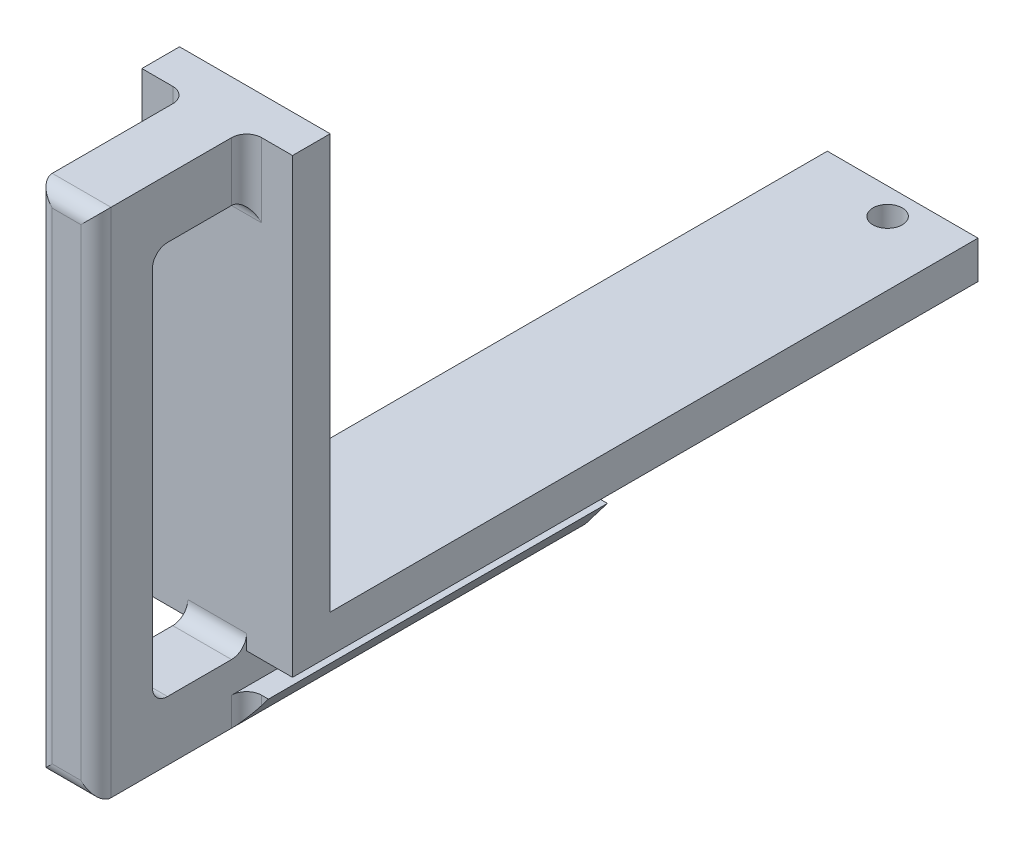
ISO-10303-21;
HEADER;
FILE_DESCRIPTION(('STEP AP214'),'2;1');
FILE_NAME('part.step','',(''),(''),'','','');
FILE_SCHEMA(('AUTOMOTIVE_DESIGN { 1 0 10303 214 1 1 1 1 }'));
ENDSEC;
DATA;
#1=APPLICATION_CONTEXT('core data for automotive mechanical design processes');
#2=APPLICATION_PROTOCOL_DEFINITION('international standard','automotive_design',2000,#1);
#3=PRODUCT_CONTEXT('',#1,'mechanical');
#4=PRODUCT('Part','Part','',(#3));
#5=PRODUCT_RELATED_PRODUCT_CATEGORY('part','',(#4));
#6=PRODUCT_DEFINITION_FORMATION('','',#4);
#7=PRODUCT_DEFINITION_CONTEXT('part definition',#1,'design');
#8=PRODUCT_DEFINITION('design','',#6,#7);
#9=PRODUCT_DEFINITION_SHAPE('','',#8);
#10=(LENGTH_UNIT() NAMED_UNIT(*) SI_UNIT(.MILLI.,.METRE.));
#11=(NAMED_UNIT(*) PLANE_ANGLE_UNIT() SI_UNIT($,.RADIAN.));
#12=(NAMED_UNIT(*) SI_UNIT($,.STERADIAN.) SOLID_ANGLE_UNIT());
#13=UNCERTAINTY_MEASURE_WITH_UNIT(LENGTH_MEASURE(1.E-05),#10,'distance_accuracy_value','');
#14=(GEOMETRIC_REPRESENTATION_CONTEXT(3) GLOBAL_UNCERTAINTY_ASSIGNED_CONTEXT((#13)) GLOBAL_UNIT_ASSIGNED_CONTEXT((#10,
#11,#12)) REPRESENTATION_CONTEXT('',''));
#15=CARTESIAN_POINT('',(0.,0.,0.));
#16=DIRECTION('',(0.,0.,1.));
#17=DIRECTION('',(1.,0.,0.));
#18=AXIS2_PLACEMENT_3D('',#15,#16,#17);
#19=CARTESIAN_POINT('',(0.,0.,48.));
#20=DIRECTION('',(0.,0.,1.));
#21=DIRECTION('',(1.,0.,0.));
#22=AXIS2_PLACEMENT_3D('',#19,#20,#21);
#23=PLANE('',#22);
#24=DIRECTION('',(1.,0.,0.));
#25=VECTOR('',#24,1.);
#26=CARTESIAN_POINT('',(-10.,0.,48.));
#27=LINE('',#26,#25);
#28=CARTESIAN_POINT('',(-10.,0.,48.));
#29=VERTEX_POINT('',#28);
#30=CARTESIAN_POINT('',(-3.90000000000001,0.,48.));
#31=VERTEX_POINT('',#30);
#32=EDGE_CURVE('E266',#29,#31,#27,.T.);
#33=ORIENTED_EDGE('',*,*,#32,.T.);
#34=DIRECTION('',(0.,1.,0.));
#35=VECTOR('',#34,1.);
#36=CARTESIAN_POINT('',(-3.90000000000001,0.,48.));
#37=LINE('',#36,#35);
#38=CARTESIAN_POINT('',(-3.90000000000001,2.,48.));
#39=VERTEX_POINT('',#38);
#40=EDGE_CURVE('E62',#31,#39,#37,.T.);
#41=ORIENTED_EDGE('',*,*,#40,.T.);
#42=DIRECTION('',(-1.,0.,0.));
#43=VECTOR('',#42,1.);
#44=CARTESIAN_POINT('',(0.,2.,48.));
#45=LINE('',#44,#43);
#46=CARTESIAN_POINT('',(3.89999999999998,2.,48.));
#47=VERTEX_POINT('',#46);
#48=EDGE_CURVE('E253',#39,#47,#45,.F.);
#49=ORIENTED_EDGE('',*,*,#48,.T.);
#50=DIRECTION('',(0.,-1.,0.));
#51=VECTOR('',#50,1.);
#52=CARTESIAN_POINT('',(3.89999999999999,-4.1,48.));
#53=LINE('',#52,#51);
#54=CARTESIAN_POINT('',(3.89999999999998,0.,48.));
#55=VERTEX_POINT('',#54);
#56=EDGE_CURVE('E248',#47,#55,#53,.T.);
#57=ORIENTED_EDGE('',*,*,#56,.T.);
#58=CARTESIAN_POINT('',(10.,0.,48.));
#59=VERTEX_POINT('',#58);
#60=EDGE_CURVE('E292',#55,#59,#27,.T.);
#61=ORIENTED_EDGE('',*,*,#60,.T.);
#62=DIRECTION('',(0.,-1.,0.));
#63=VECTOR('',#62,1.);
#64=CARTESIAN_POINT('',(10.,60.,48.));
#65=LINE('',#64,#63);
#66=CARTESIAN_POINT('',(10.,60.,48.));
#67=VERTEX_POINT('',#66);
#68=EDGE_CURVE('E328',#67,#59,#65,.T.);
#69=ORIENTED_EDGE('',*,*,#68,.F.);
#70=DIRECTION('',(1.,0.,0.));
#71=VECTOR('',#70,1.);
#72=CARTESIAN_POINT('',(-10.,60.,48.));
#73=LINE('',#72,#71);
#74=CARTESIAN_POINT('',(5.89999999999995,60.,48.));
#75=VERTEX_POINT('',#74);
#76=EDGE_CURVE('E307',#75,#67,#73,.T.);
#77=ORIENTED_EDGE('',*,*,#76,.F.);
#78=DIRECTION('',(0.,1.,0.));
#79=VECTOR('',#78,1.);
#80=CARTESIAN_POINT('',(5.89999999999995,52.2,48.));
#81=LINE('',#80,#79);
#82=CARTESIAN_POINT('',(5.89999999999995,50.2,48.));
#83=VERTEX_POINT('',#82);
#84=EDGE_CURVE('E255',#75,#83,#81,.F.);
#85=ORIENTED_EDGE('',*,*,#84,.T.);
#86=DIRECTION('',(1.,0.,0.));
#87=VECTOR('',#86,1.);
#88=CARTESIAN_POINT('',(0.,50.2,48.));
#89=LINE('',#88,#87);
#90=CARTESIAN_POINT('',(-5.89999999999999,50.2,48.));
#91=VERTEX_POINT('',#90);
#92=EDGE_CURVE('E231',#83,#91,#89,.F.);
#93=ORIENTED_EDGE('',*,*,#92,.T.);
#94=DIRECTION('',(0.,-1.,0.));
#95=VECTOR('',#94,1.);
#96=CARTESIAN_POINT('',(-5.89999999999999,60.,48.));
#97=LINE('',#96,#95);
#98=CARTESIAN_POINT('',(-5.89999999999999,60.,48.));
#99=VERTEX_POINT('',#98);
#100=EDGE_CURVE('E242',#91,#99,#97,.F.);
#101=ORIENTED_EDGE('',*,*,#100,.T.);
#102=CARTESIAN_POINT('',(-10.,60.,48.));
#103=VERTEX_POINT('',#102);
#104=EDGE_CURVE('E308',#103,#99,#73,.T.);
#105=ORIENTED_EDGE('',*,*,#104,.F.);
#106=DIRECTION('',(0.,-1.,0.));
#107=VECTOR('',#106,1.);
#108=CARTESIAN_POINT('',(-10.,60.,48.));
#109=LINE('',#108,#107);
#110=EDGE_CURVE('E332',#103,#29,#109,.T.);
#111=ORIENTED_EDGE('',*,*,#110,.T.);
#112=EDGE_LOOP('',(#33,#41,#49,#57,#61,#69,#77,#85,#93,#101,#105,#111));
#113=FACE_BOUND('',#112,.T.);
#114=ADVANCED_FACE('F43',(#113),#23,.T.);
#115=DIRECTION('',(-1.,0.,0.));
#116=VECTOR('',#115,1.);
#117=CARTESIAN_POINT('',(6.79999999999999,-4.1,48.));
#118=LINE('',#117,#116);
#119=CARTESIAN_POINT('',(6.79999999999999,-4.1,48.));
#120=VERTEX_POINT('',#119);
#121=CARTESIAN_POINT('',(5.89999999999999,-4.1,48.));
#122=VERTEX_POINT('',#121);
#123=EDGE_CURVE('E143',#120,#122,#118,.T.);
#124=ORIENTED_EDGE('',*,*,#123,.T.);
#125=DIRECTION('',(0.,1.,0.));
#126=VECTOR('',#125,1.);
#127=CARTESIAN_POINT('',(5.89999999999999,-7.9,48.));
#128=LINE('',#127,#126);
#129=CARTESIAN_POINT('',(5.89999999999999,-5.27931034482758,48.));
#130=VERTEX_POINT('',#129);
#131=EDGE_CURVE('E133',#122,#130,#128,.F.);
#132=ORIENTED_EDGE('',*,*,#131,.T.);
#133=DIRECTION('',(0.606673319350191,0.794951246045077,0.));
#134=VECTOR('',#133,1.);
#135=CARTESIAN_POINT('',(3.89999999999999,-7.9,48.));
#136=LINE('',#135,#134);
#137=EDGE_CURVE('E155',#130,#120,#136,.T.);
#138=ORIENTED_EDGE('',*,*,#137,.T.);
#139=EDGE_LOOP('',(#124,#132,#138));
#140=FACE_BOUND('',#139,.T.);
#141=ADVANCED_FACE('F154',(#140),#23,.T.);
#142=DIRECTION('',(0.606673319350191,-0.794951246045077,0.));
#143=VECTOR('',#142,1.);
#144=CARTESIAN_POINT('',(-6.80000000000001,-4.1,48.));
#145=LINE('',#144,#143);
#146=CARTESIAN_POINT('',(-6.80000000000001,-4.1,48.));
#147=VERTEX_POINT('',#146);
#148=CARTESIAN_POINT('',(-5.90000000000002,-5.27931034482759,48.));
#149=VERTEX_POINT('',#148);
#150=EDGE_CURVE('E339',#147,#149,#145,.T.);
#151=ORIENTED_EDGE('',*,*,#150,.T.);
#152=DIRECTION('',(0.,-1.,0.));
#153=VECTOR('',#152,1.);
#154=CARTESIAN_POINT('',(-5.90000000000001,-4.1,48.));
#155=LINE('',#154,#153);
#156=CARTESIAN_POINT('',(-5.90000000000001,-4.1,48.));
#157=VERTEX_POINT('',#156);
#158=EDGE_CURVE('E165',#149,#157,#155,.F.);
#159=ORIENTED_EDGE('',*,*,#158,.T.);
#160=DIRECTION('',(-1.,0.,0.));
#161=VECTOR('',#160,1.);
#162=CARTESIAN_POINT('',(-3.90000000000001,-4.1,48.));
#163=LINE('',#162,#161);
#164=EDGE_CURVE('E335',#157,#147,#163,.T.);
#165=ORIENTED_EDGE('',*,*,#164,.T.);
#166=EDGE_LOOP('',(#151,#159,#165));
#167=FACE_BOUND('',#166,.T.);
#168=ADVANCED_FACE('F699',(#167),#23,.T.);
#169=CARTESIAN_POINT('',(10.,5.,43.));
#170=DIRECTION('',(-1.,0.,0.));
#171=DIRECTION('',(0.,0.,1.));
#172=AXIS2_PLACEMENT_3D('',#169,#170,#171);
#173=PLANE('',#172);
#174=DIRECTION('',(0.,0.,-1.));
#175=VECTOR('',#174,1.);
#176=CARTESIAN_POINT('',(10.,0.,43.));
#177=LINE('',#176,#175);
#178=CARTESIAN_POINT('',(10.,0.,-43.));
#179=VERTEX_POINT('',#178);
#180=EDGE_CURVE('E391',#59,#179,#177,.T.);
#181=ORIENTED_EDGE('',*,*,#180,.T.);
#182=DIRECTION('',(0.,-1.,0.));
#183=VECTOR('',#182,1.);
#184=CARTESIAN_POINT('',(10.,5.,-43.));
#185=LINE('',#184,#183);
#186=CARTESIAN_POINT('',(10.,5.,-43.));
#187=VERTEX_POINT('',#186);
#188=EDGE_CURVE('E442',#187,#179,#185,.T.);
#189=ORIENTED_EDGE('',*,*,#188,.F.);
#190=DIRECTION('',(0.,0.,-1.));
#191=VECTOR('',#190,1.);
#192=CARTESIAN_POINT('',(10.,5.,43.));
#193=LINE('',#192,#191);
#194=CARTESIAN_POINT('',(10.,5.,43.));
#195=VERTEX_POINT('',#194);
#196=EDGE_CURVE('E411',#195,#187,#193,.T.);
#197=ORIENTED_EDGE('',*,*,#196,.F.);
#198=DIRECTION('',(0.,-1.,0.));
#199=VECTOR('',#198,1.);
#200=CARTESIAN_POINT('',(10.,60.,43.));
#201=LINE('',#200,#199);
#202=CARTESIAN_POINT('',(10.,60.,43.));
#203=VERTEX_POINT('',#202);
#204=EDGE_CURVE('E324',#203,#195,#201,.T.);
#205=ORIENTED_EDGE('',*,*,#204,.F.);
#206=DIRECTION('',(0.,0.,-1.));
#207=VECTOR('',#206,1.);
#208=CARTESIAN_POINT('',(10.,60.,43.));
#209=LINE('',#208,#207);
#210=EDGE_CURVE('E311',#67,#203,#209,.T.);
#211=ORIENTED_EDGE('',*,*,#210,.F.);
#212=ORIENTED_EDGE('',*,*,#68,.T.);
#213=EDGE_LOOP('',(#181,#189,#197,#205,#211,#212));
#214=FACE_BOUND('',#213,.T.);
#215=ADVANCED_FACE('F706',(#214),#173,.F.);
#216=CARTESIAN_POINT('',(-10.,5.,-43.));
#217=DIRECTION('',(0.,0.,1.));
#218=DIRECTION('',(1.,0.,0.));
#219=AXIS2_PLACEMENT_3D('',#216,#217,#218);
#220=PLANE('',#219);
#221=DIRECTION('',(-1.,0.,0.));
#222=VECTOR('',#221,1.);
#223=CARTESIAN_POINT('',(-10.,0.,-43.));
#224=LINE('',#223,#222);
#225=CARTESIAN_POINT('',(-10.,0.,-43.));
#226=VERTEX_POINT('',#225);
#227=EDGE_CURVE('E432',#179,#226,#224,.T.);
#228=ORIENTED_EDGE('',*,*,#227,.T.);
#229=DIRECTION('',(0.,-1.,0.));
#230=VECTOR('',#229,1.);
#231=CARTESIAN_POINT('',(-10.,5.,-43.));
#232=LINE('',#231,#230);
#233=CARTESIAN_POINT('',(-10.,5.,-43.));
#234=VERTEX_POINT('',#233);
#235=EDGE_CURVE('E428',#234,#226,#232,.T.);
#236=ORIENTED_EDGE('',*,*,#235,.F.);
#237=DIRECTION('',(-1.,0.,0.));
#238=VECTOR('',#237,1.);
#239=CARTESIAN_POINT('',(-10.,5.,-43.));
#240=LINE('',#239,#238);
#241=EDGE_CURVE('E415',#187,#234,#240,.T.);
#242=ORIENTED_EDGE('',*,*,#241,.F.);
#243=ORIENTED_EDGE('',*,*,#188,.T.);
#244=EDGE_LOOP('',(#228,#236,#242,#243));
#245=FACE_BOUND('',#244,.T.);
#246=ADVANCED_FACE('F711',(#245),#220,.F.);
#247=CARTESIAN_POINT('',(-10.,5.,43.));
#248=DIRECTION('',(1.,0.,0.));
#249=DIRECTION('',(0.,0.,-1.));
#250=AXIS2_PLACEMENT_3D('',#247,#248,#249);
#251=PLANE('',#250);
#252=DIRECTION('',(0.,0.,1.));
#253=VECTOR('',#252,1.);
#254=CARTESIAN_POINT('',(-10.,0.,43.));
#255=LINE('',#254,#253);
#256=EDGE_CURVE('E416',#226,#29,#255,.T.);
#257=ORIENTED_EDGE('',*,*,#256,.T.);
#258=ORIENTED_EDGE('',*,*,#110,.F.);
#259=DIRECTION('',(0.,0.,1.));
#260=VECTOR('',#259,1.);
#261=CARTESIAN_POINT('',(-10.,60.,43.));
#262=LINE('',#261,#260);
#263=CARTESIAN_POINT('',(-10.,60.,43.));
#264=VERTEX_POINT('',#263);
#265=EDGE_CURVE('E303',#264,#103,#262,.T.);
#266=ORIENTED_EDGE('',*,*,#265,.F.);
#267=DIRECTION('',(0.,-1.,0.));
#268=VECTOR('',#267,1.);
#269=CARTESIAN_POINT('',(-10.,60.,43.));
#270=LINE('',#269,#268);
#271=CARTESIAN_POINT('',(-10.,5.,43.));
#272=VERTEX_POINT('',#271);
#273=EDGE_CURVE('E318',#264,#272,#270,.T.);
#274=ORIENTED_EDGE('',*,*,#273,.T.);
#275=DIRECTION('',(0.,0.,1.));
#276=VECTOR('',#275,1.);
#277=CARTESIAN_POINT('',(-10.,5.,43.));
#278=LINE('',#277,#276);
#279=EDGE_CURVE('E420',#234,#272,#278,.T.);
#280=ORIENTED_EDGE('',*,*,#279,.F.);
#281=ORIENTED_EDGE('',*,*,#235,.T.);
#282=EDGE_LOOP('',(#257,#258,#266,#274,#280,#281));
#283=FACE_BOUND('',#282,.T.);
#284=ADVANCED_FACE('F632',(#283),#251,.F.);
#285=CARTESIAN_POINT('',(0.,5.,0.));
#286=DIRECTION('',(0.,-1.,0.));
#287=DIRECTION('',(0.,0.,-1.));
#288=AXIS2_PLACEMENT_3D('',#285,#286,#287);
#289=PLANE('',#288);
#290=CARTESIAN_POINT('',(1.49999999999999,5.,39.5));
#291=DIRECTION('',(0.,1.,0.));
#292=DIRECTION('',(0.,0.,1.));
#293=AXIS2_PLACEMENT_3D('',#290,#291,#292);
#294=CIRCLE('',#293,1.95);
#295=CARTESIAN_POINT('',(1.49999999999999,5.,41.45));
#296=VERTEX_POINT('',#295);
#297=EDGE_CURVE('E350',#296,#296,#294,.T.);
#298=ORIENTED_EDGE('',*,*,#297,.F.);
#299=EDGE_LOOP('',(#298));
#300=FACE_BOUND('',#299,.T.);
#301=CARTESIAN_POINT('',(1.49999999999998,5.,-39.5));
#302=DIRECTION('',(0.,1.,0.));
#303=DIRECTION('',(0.,0.,1.));
#304=AXIS2_PLACEMENT_3D('',#301,#302,#303);
#305=CIRCLE('',#304,1.95);
#306=CARTESIAN_POINT('',(1.49999999999998,5.,-37.55));
#307=VERTEX_POINT('',#306);
#308=EDGE_CURVE('E158',#307,#307,#305,.T.);
#309=ORIENTED_EDGE('',*,*,#308,.F.);
#310=EDGE_LOOP('',(#309));
#311=FACE_BOUND('',#310,.T.);
#312=ORIENTED_EDGE('',*,*,#196,.T.);
#313=ORIENTED_EDGE('',*,*,#241,.T.);
#314=ORIENTED_EDGE('',*,*,#279,.T.);
#315=DIRECTION('',(1.,0.,0.));
#316=VECTOR('',#315,1.);
#317=CARTESIAN_POINT('',(-10.,5.,43.));
#318=LINE('',#317,#316);
#319=EDGE_CURVE('E424',#272,#195,#318,.T.);
#320=ORIENTED_EDGE('',*,*,#319,.T.);
#321=EDGE_LOOP('',(#312,#313,#314,#320));
#322=FACE_BOUND('',#321,.T.);
#323=ADVANCED_FACE('F730',(#300,#311,#322),#289,.F.);
#324=CARTESIAN_POINT('',(0.,0.,0.));
#325=DIRECTION('',(0.,-1.,0.));
#326=DIRECTION('',(0.,0.,-1.));
#327=AXIS2_PLACEMENT_3D('',#324,#325,#326);
#328=PLANE('',#327);
#329=CARTESIAN_POINT('',(1.49999999999998,0.,-39.5));
#330=DIRECTION('',(0.,-1.,0.));
#331=DIRECTION('',(0.,0.,-1.));
#332=AXIS2_PLACEMENT_3D('',#329,#330,#331);
#333=CIRCLE('',#332,1.95);
#334=CARTESIAN_POINT('',(1.49999999999998,0.,-41.45));
#335=VERTEX_POINT('',#334);
#336=EDGE_CURVE('E349',#335,#335,#333,.T.);
#337=ORIENTED_EDGE('',*,*,#336,.F.);
#338=EDGE_LOOP('',(#337));
#339=FACE_BOUND('',#338,.T.);
#340=DIRECTION('',(0.,0.,1.));
#341=VECTOR('',#340,1.);
#342=CARTESIAN_POINT('',(3.89999999999998,0.,2.99999999999999));
#343=LINE('',#342,#341);
#344=CARTESIAN_POINT('',(3.89999999999998,0.,2.99999999999999));
#345=VERTEX_POINT('',#344);
#346=EDGE_CURVE('E388',#345,#55,#343,.T.);
#347=ORIENTED_EDGE('',*,*,#346,.F.);
#348=DIRECTION('',(-1.,0.,0.));
#349=VECTOR('',#348,1.);
#350=CARTESIAN_POINT('',(-3.90000000000001,0.,2.99999999999999));
#351=LINE('',#350,#349);
#352=CARTESIAN_POINT('',(-3.90000000000001,0.,2.99999999999999));
#353=VERTEX_POINT('',#352);
#354=EDGE_CURVE('E357',#345,#353,#351,.T.);
#355=ORIENTED_EDGE('',*,*,#354,.T.);
#356=DIRECTION('',(0.,0.,1.));
#357=VECTOR('',#356,1.);
#358=CARTESIAN_POINT('',(-3.90000000000001,0.,2.99999999999999));
#359=LINE('',#358,#357);
#360=EDGE_CURVE('E387',#353,#31,#359,.T.);
#361=ORIENTED_EDGE('',*,*,#360,.T.);
#362=ORIENTED_EDGE('',*,*,#32,.F.);
#363=ORIENTED_EDGE('',*,*,#256,.F.);
#364=ORIENTED_EDGE('',*,*,#227,.F.);
#365=ORIENTED_EDGE('',*,*,#180,.F.);
#366=ORIENTED_EDGE('',*,*,#60,.F.);
#367=EDGE_LOOP('',(#347,#355,#361,#362,#363,#364,#365,#366));
#368=FACE_BOUND('',#367,.T.);
#369=ADVANCED_FACE('F638',(#339,#368),#328,.T.);
#370=CARTESIAN_POINT('',(3.89999999999999,-4.1,2.99999999999999));
#371=DIRECTION('',(1.,0.,0.));
#372=DIRECTION('',(0.,1.,0.));
#373=AXIS2_PLACEMENT_3D('',#370,#371,#372);
#374=PLANE('',#373);
#375=DIRECTION('',(0.,0.,-1.));
#376=VECTOR('',#375,1.);
#377=CARTESIAN_POINT('',(3.89999999999999,60.,60.5));
#378=LINE('',#377,#376);
#379=CARTESIAN_POINT('',(3.89999999999999,60.,66.));
#380=VERTEX_POINT('',#379);
#381=CARTESIAN_POINT('',(3.89999999999999,60.,50.));
#382=VERTEX_POINT('',#381);
#383=EDGE_CURVE('E535',#380,#382,#378,.T.);
#384=ORIENTED_EDGE('',*,*,#383,.F.);
#385=DIRECTION('',(0.,1.,0.));
#386=VECTOR('',#385,1.);
#387=CARTESIAN_POINT('',(3.89999999999999,-4.1,66.));
#388=LINE('',#387,#386);
#389=CARTESIAN_POINT('',(3.89999999999999,-7.9,66.));
#390=VERTEX_POINT('',#389);
#391=EDGE_CURVE('E476',#380,#390,#388,.F.);
#392=ORIENTED_EDGE('',*,*,#391,.T.);
#393=DIRECTION('',(0.,0.,-1.));
#394=VECTOR('',#393,1.);
#395=CARTESIAN_POINT('',(3.89999999999999,-7.9,60.5));
#396=LINE('',#395,#394);
#397=CARTESIAN_POINT('',(3.89999999999999,-7.9,50.));
#398=VERTEX_POINT('',#397);
#399=EDGE_CURVE('E534',#390,#398,#396,.T.);
#400=ORIENTED_EDGE('',*,*,#399,.T.);
#401=DIRECTION('',(0.,1.,0.));
#402=VECTOR('',#401,1.);
#403=CARTESIAN_POINT('',(3.89999999999999,-4.1,50.));
#404=LINE('',#403,#402);
#405=CARTESIAN_POINT('',(3.89999999999999,-4.1,50.));
#406=VERTEX_POINT('',#405);
#407=EDGE_CURVE('E473',#398,#406,#404,.T.);
#408=ORIENTED_EDGE('',*,*,#407,.T.);
#409=DIRECTION('',(0.,0.,1.));
#410=VECTOR('',#409,1.);
#411=CARTESIAN_POINT('',(3.89999999999999,-4.1,2.99999999999999));
#412=LINE('',#411,#410);
#413=CARTESIAN_POINT('',(3.89999999999999,-4.1,2.99999999999999));
#414=VERTEX_POINT('',#413);
#415=EDGE_CURVE('E146',#414,#406,#412,.T.);
#416=ORIENTED_EDGE('',*,*,#415,.F.);
#417=DIRECTION('',(0.,1.,0.));
#418=VECTOR('',#417,1.);
#419=CARTESIAN_POINT('',(3.89999999999999,-4.1,2.99999999999999));
#420=LINE('',#419,#418);
#421=EDGE_CURVE('E383',#414,#345,#420,.T.);
#422=ORIENTED_EDGE('',*,*,#421,.T.);
#423=ORIENTED_EDGE('',*,*,#346,.T.);
#424=ORIENTED_EDGE('',*,*,#56,.F.);
#425=CARTESIAN_POINT('',(3.89999999999998,2.,50.));
#426=DIRECTION('',(1.,0.,0.));
#427=DIRECTION('',(0.,1.,0.));
#428=AXIS2_PLACEMENT_3D('',#425,#426,#427);
#429=CIRCLE('',#428,2.);
#430=CARTESIAN_POINT('',(3.89999999999998,0.,50.));
#431=VERTEX_POINT('',#430);
#432=EDGE_CURVE('E54',#47,#431,#429,.F.);
#433=ORIENTED_EDGE('',*,*,#432,.T.);
#434=DIRECTION('',(0.,0.,-1.));
#435=VECTOR('',#434,1.);
#436=CARTESIAN_POINT('',(3.89999999999998,0.,60.5));
#437=LINE('',#436,#435);
#438=CARTESIAN_POINT('',(3.89999999999998,0.,58.5));
#439=VERTEX_POINT('',#438);
#440=EDGE_CURVE('E279',#439,#431,#437,.T.);
#441=ORIENTED_EDGE('',*,*,#440,.F.);
#442=CARTESIAN_POINT('',(3.89999999999998,2.,58.5));
#443=DIRECTION('',(1.,0.,0.));
#444=DIRECTION('',(0.,1.,0.));
#445=AXIS2_PLACEMENT_3D('',#442,#443,#444);
#446=CIRCLE('',#445,2.);
#447=CARTESIAN_POINT('',(3.89999999999999,2.,60.5));
#448=VERTEX_POINT('',#447);
#449=EDGE_CURVE('E180',#439,#448,#446,.F.);
#450=ORIENTED_EDGE('',*,*,#449,.T.);
#451=DIRECTION('',(0.,1.,0.));
#452=VECTOR('',#451,1.);
#453=CARTESIAN_POINT('',(3.89999999999998,60.,60.5));
#454=LINE('',#453,#452);
#455=CARTESIAN_POINT('',(3.89999999999998,50.2,60.5));
#456=VERTEX_POINT('',#455);
#457=EDGE_CURVE('E669',#448,#456,#454,.T.);
#458=ORIENTED_EDGE('',*,*,#457,.T.);
#459=CARTESIAN_POINT('',(3.89999999999995,50.2,58.5));
#460=DIRECTION('',(1.,0.,0.));
#461=DIRECTION('',(0.,1.,0.));
#462=AXIS2_PLACEMENT_3D('',#459,#460,#461);
#463=CIRCLE('',#462,2.);
#464=CARTESIAN_POINT('',(3.89999999999999,52.2,58.5));
#465=VERTEX_POINT('',#464);
#466=EDGE_CURVE('E164',#456,#465,#463,.F.);
#467=ORIENTED_EDGE('',*,*,#466,.T.);
#468=DIRECTION('',(0.,0.,-1.));
#469=VECTOR('',#468,1.);
#470=CARTESIAN_POINT('',(3.89999999999999,52.2,60.5));
#471=LINE('',#470,#469);
#472=CARTESIAN_POINT('',(3.89999999999999,52.2,50.));
#473=VERTEX_POINT('',#472);
#474=EDGE_CURVE('E541',#465,#473,#471,.T.);
#475=ORIENTED_EDGE('',*,*,#474,.T.);
#476=DIRECTION('',(0.,1.,0.));
#477=VECTOR('',#476,1.);
#478=CARTESIAN_POINT('',(3.89999999999995,60.,50.));
#479=LINE('',#478,#477);
#480=EDGE_CURVE('E469',#473,#382,#479,.T.);
#481=ORIENTED_EDGE('',*,*,#480,.T.);
#482=EDGE_LOOP('',(#384,#392,#400,#408,#416,#422,#423,#424,#433,#441,#450,#458,#467,#475,#481));
#483=FACE_BOUND('',#482,.T.);
#484=ADVANCED_FACE('F277',(#483),#374,.T.);
#485=CARTESIAN_POINT('',(6.79999999999999,-4.1,2.99999999999999));
#486=DIRECTION('',(0.,1.,0.));
#487=DIRECTION('',(0.,0.,1.));
#488=AXIS2_PLACEMENT_3D('',#485,#486,#487);
#489=PLANE('',#488);
#490=ORIENTED_EDGE('',*,*,#415,.T.);
#491=CARTESIAN_POINT('',(5.89999999999999,-4.1,50.));
#492=DIRECTION('',(0.,1.,0.));
#493=DIRECTION('',(0.,0.,1.));
#494=AXIS2_PLACEMENT_3D('',#491,#492,#493);
#495=CIRCLE('',#494,2.);
#496=EDGE_CURVE('E139',#406,#122,#495,.F.);
#497=ORIENTED_EDGE('',*,*,#496,.T.);
#498=ORIENTED_EDGE('',*,*,#123,.F.);
#499=DIRECTION('',(0.,0.,1.));
#500=VECTOR('',#499,1.);
#501=CARTESIAN_POINT('',(6.79999999999999,-4.1,2.99999999999999));
#502=LINE('',#501,#500);
#503=CARTESIAN_POINT('',(6.79999999999999,-4.1,2.99999999999999));
#504=VERTEX_POINT('',#503);
#505=EDGE_CURVE('E394',#504,#120,#502,.T.);
#506=ORIENTED_EDGE('',*,*,#505,.F.);
#507=DIRECTION('',(-1.,0.,0.));
#508=VECTOR('',#507,1.);
#509=CARTESIAN_POINT('',(6.79999999999999,-4.1,2.99999999999999));
#510=LINE('',#509,#508);
#511=EDGE_CURVE('E380',#504,#414,#510,.T.);
#512=ORIENTED_EDGE('',*,*,#511,.T.);
#513=EDGE_LOOP('',(#490,#497,#498,#506,#512));
#514=FACE_BOUND('',#513,.T.);
#515=ADVANCED_FACE('F140',(#514),#489,.T.);
#516=CARTESIAN_POINT('',(3.89999999999999,-7.9,2.99999999999999));
#517=DIRECTION('',(0.794951246045077,-0.606673319350191,0.));
#518=DIRECTION('',(0.606673319350191,0.794951246045077,0.));
#519=AXIS2_PLACEMENT_3D('',#516,#517,#518);
#520=PLANE('',#519);
#521=ORIENTED_EDGE('',*,*,#505,.T.);
#522=ORIENTED_EDGE('',*,*,#137,.F.);
#523=CARTESIAN_POINT('',(5.89999999999999,-5.27931034482758,50.));
#524=DIRECTION('',(0.794951246045077,-0.606673319350191,0.));
#525=DIRECTION('',(-0.606673319350191,-0.794951246045078,0.));
#526=AXIS2_PLACEMENT_3D('',#523,#524,#525);
#527=ELLIPSE('',#526,3.29666714557713,2.);
#528=EDGE_CURVE('E151',#130,#398,#527,.F.);
#529=ORIENTED_EDGE('',*,*,#528,.T.);
#530=DIRECTION('',(0.,0.,1.));
#531=VECTOR('',#530,1.);
#532=CARTESIAN_POINT('',(3.89999999999999,-7.9,2.99999999999999));
#533=LINE('',#532,#531);
#534=CARTESIAN_POINT('',(3.89999999999999,-7.9,2.99999999999999));
#535=VERTEX_POINT('',#534);
#536=EDGE_CURVE('E397',#535,#398,#533,.T.);
#537=ORIENTED_EDGE('',*,*,#536,.F.);
#538=DIRECTION('',(0.606673319350191,0.794951246045077,0.));
#539=VECTOR('',#538,1.);
#540=CARTESIAN_POINT('',(3.89999999999999,-7.9,2.99999999999999));
#541=LINE('',#540,#539);
#542=EDGE_CURVE('E376',#535,#504,#541,.T.);
#543=ORIENTED_EDGE('',*,*,#542,.T.);
#544=EDGE_LOOP('',(#521,#522,#529,#537,#543));
#545=FACE_BOUND('',#544,.T.);
#546=ADVANCED_FACE('F724',(#545),#520,.T.);
#547=CARTESIAN_POINT('',(-3.90000000000001,-7.9,2.99999999999999));
#548=DIRECTION('',(0.,-1.,0.));
#549=DIRECTION('',(1.,0.,0.));
#550=AXIS2_PLACEMENT_3D('',#547,#548,#549);
#551=PLANE('',#550);
#552=ORIENTED_EDGE('',*,*,#399,.F.);
#553=DIRECTION('',(1.,0.,0.));
#554=VECTOR('',#553,1.);
#555=CARTESIAN_POINT('',(-3.90000000000001,-7.9,66.));
#556=LINE('',#555,#554);
#557=CARTESIAN_POINT('',(-3.89999999999999,-7.9,66.));
#558=VERTEX_POINT('',#557);
#559=EDGE_CURVE('E88',#390,#558,#556,.F.);
#560=ORIENTED_EDGE('',*,*,#559,.T.);
#561=DIRECTION('',(0.,0.,-1.));
#562=VECTOR('',#561,1.);
#563=CARTESIAN_POINT('',(-3.89999999999999,-7.9,60.5));
#564=LINE('',#563,#562);
#565=CARTESIAN_POINT('',(-3.90000000000001,-7.9,50.));
#566=VERTEX_POINT('',#565);
#567=EDGE_CURVE('E299',#558,#566,#564,.T.);
#568=ORIENTED_EDGE('',*,*,#567,.T.);
#569=DIRECTION('',(0.,0.,1.));
#570=VECTOR('',#569,1.);
#571=CARTESIAN_POINT('',(-3.90000000000001,-7.9,2.99999999999999));
#572=LINE('',#571,#570);
#573=CARTESIAN_POINT('',(-3.90000000000001,-7.9,2.99999999999999));
#574=VERTEX_POINT('',#573);
#575=EDGE_CURVE('E76',#574,#566,#572,.T.);
#576=ORIENTED_EDGE('',*,*,#575,.F.);
#577=DIRECTION('',(1.,0.,0.));
#578=VECTOR('',#577,1.);
#579=CARTESIAN_POINT('',(-3.90000000000001,-7.9,2.99999999999999));
#580=LINE('',#579,#578);
#581=EDGE_CURVE('E372',#574,#535,#580,.T.);
#582=ORIENTED_EDGE('',*,*,#581,.T.);
#583=ORIENTED_EDGE('',*,*,#536,.T.);
#584=EDGE_LOOP('',(#552,#560,#568,#576,#582,#583));
#585=FACE_BOUND('',#584,.T.);
#586=ADVANCED_FACE('F538',(#585),#551,.T.);
#587=CARTESIAN_POINT('',(-6.80000000000001,-4.1,2.99999999999999));
#588=DIRECTION('',(-0.794951246045077,-0.606673319350191,0.));
#589=DIRECTION('',(0.606673319350191,-0.794951246045077,0.));
#590=AXIS2_PLACEMENT_3D('',#587,#588,#589);
#591=PLANE('',#590);
#592=ORIENTED_EDGE('',*,*,#575,.T.);
#593=CARTESIAN_POINT('',(-5.90000000000002,-5.27931034482759,50.));
#594=DIRECTION('',(-0.794951246045077,-0.606673319350191,0.));
#595=DIRECTION('',(-0.606673319350191,0.794951246045077,0.));
#596=AXIS2_PLACEMENT_3D('',#593,#594,#595);
#597=ELLIPSE('',#596,3.29666714557713,2.);
#598=EDGE_CURVE('E188',#566,#149,#597,.F.);
#599=ORIENTED_EDGE('',*,*,#598,.T.);
#600=ORIENTED_EDGE('',*,*,#150,.F.);
#601=DIRECTION('',(0.,0.,1.));
#602=VECTOR('',#601,1.);
#603=CARTESIAN_POINT('',(-6.80000000000001,-4.1,2.99999999999999));
#604=LINE('',#603,#602);
#605=CARTESIAN_POINT('',(-6.80000000000001,-4.1,2.99999999999999));
#606=VERTEX_POINT('',#605);
#607=EDGE_CURVE('E402',#606,#147,#604,.T.);
#608=ORIENTED_EDGE('',*,*,#607,.F.);
#609=DIRECTION('',(0.606673319350191,-0.794951246045077,0.));
#610=VECTOR('',#609,1.);
#611=CARTESIAN_POINT('',(-6.80000000000001,-4.1,2.99999999999999));
#612=LINE('',#611,#610);
#613=EDGE_CURVE('E369',#606,#574,#612,.T.);
#614=ORIENTED_EDGE('',*,*,#613,.T.);
#615=EDGE_LOOP('',(#592,#599,#600,#608,#614));
#616=FACE_BOUND('',#615,.T.);
#617=ADVANCED_FACE('F716',(#616),#591,.T.);
#618=CARTESIAN_POINT('',(-3.90000000000001,-4.1,2.99999999999999));
#619=DIRECTION('',(0.,1.,0.));
#620=DIRECTION('',(-1.,0.,0.));
#621=AXIS2_PLACEMENT_3D('',#618,#619,#620);
#622=PLANE('',#621);
#623=ORIENTED_EDGE('',*,*,#607,.T.);
#624=ORIENTED_EDGE('',*,*,#164,.F.);
#625=CARTESIAN_POINT('',(-5.90000000000001,-4.1,50.));
#626=DIRECTION('',(0.,1.,0.));
#627=DIRECTION('',(-1.,0.,0.));
#628=AXIS2_PLACEMENT_3D('',#625,#626,#627);
#629=CIRCLE('',#628,2.);
#630=CARTESIAN_POINT('',(-3.90000000000001,-4.1,50.));
#631=VERTEX_POINT('',#630);
#632=EDGE_CURVE('E152',#157,#631,#629,.F.);
#633=ORIENTED_EDGE('',*,*,#632,.T.);
#634=DIRECTION('',(0.,0.,1.));
#635=VECTOR('',#634,1.);
#636=CARTESIAN_POINT('',(-3.90000000000001,-4.1,2.99999999999999));
#637=LINE('',#636,#635);
#638=CARTESIAN_POINT('',(-3.90000000000001,-4.1,2.99999999999999));
#639=VERTEX_POINT('',#638);
#640=EDGE_CURVE('E406',#639,#631,#637,.T.);
#641=ORIENTED_EDGE('',*,*,#640,.F.);
#642=DIRECTION('',(-1.,0.,0.));
#643=VECTOR('',#642,1.);
#644=CARTESIAN_POINT('',(-3.90000000000001,-4.1,2.99999999999999));
#645=LINE('',#644,#643);
#646=EDGE_CURVE('E365',#639,#606,#645,.T.);
#647=ORIENTED_EDGE('',*,*,#646,.T.);
#648=EDGE_LOOP('',(#623,#624,#633,#641,#647));
#649=FACE_BOUND('',#648,.T.);
#650=ADVANCED_FACE('F648',(#649),#622,.T.);
#651=CARTESIAN_POINT('',(-3.90000000000001,0.,2.99999999999999));
#652=DIRECTION('',(-1.,0.,0.));
#653=DIRECTION('',(0.,-1.,0.));
#654=AXIS2_PLACEMENT_3D('',#651,#652,#653);
#655=PLANE('',#654);
#656=ORIENTED_EDGE('',*,*,#567,.F.);
#657=DIRECTION('',(0.,-1.,0.));
#658=VECTOR('',#657,1.);
#659=CARTESIAN_POINT('',(-3.90000000000001,0.,66.));
#660=LINE('',#659,#658);
#661=CARTESIAN_POINT('',(-3.89999999999998,60.,66.));
#662=VERTEX_POINT('',#661);
#663=EDGE_CURVE('E488',#558,#662,#660,.F.);
#664=ORIENTED_EDGE('',*,*,#663,.T.);
#665=DIRECTION('',(0.,0.,-1.));
#666=VECTOR('',#665,1.);
#667=CARTESIAN_POINT('',(-3.89999999999998,60.,60.5));
#668=LINE('',#667,#666);
#669=CARTESIAN_POINT('',(-3.89999999999998,60.,50.));
#670=VERTEX_POINT('',#669);
#671=EDGE_CURVE('E663',#662,#670,#668,.T.);
#672=ORIENTED_EDGE('',*,*,#671,.T.);
#673=DIRECTION('',(0.,-1.,0.));
#674=VECTOR('',#673,1.);
#675=CARTESIAN_POINT('',(-3.89999999999999,52.2,50.));
#676=LINE('',#675,#674);
#677=CARTESIAN_POINT('',(-3.89999999999998,52.2,50.));
#678=VERTEX_POINT('',#677);
#679=EDGE_CURVE('E240',#670,#678,#676,.T.);
#680=ORIENTED_EDGE('',*,*,#679,.T.);
#681=DIRECTION('',(0.,0.,-1.));
#682=VECTOR('',#681,1.);
#683=CARTESIAN_POINT('',(-3.89999999999998,52.2,60.5));
#684=LINE('',#683,#682);
#685=CARTESIAN_POINT('',(-3.89999999999998,52.2,58.5));
#686=VERTEX_POINT('',#685);
#687=EDGE_CURVE('E659',#686,#678,#684,.T.);
#688=ORIENTED_EDGE('',*,*,#687,.F.);
#689=CARTESIAN_POINT('',(-3.89999999999999,50.2,58.5));
#690=DIRECTION('',(-1.,0.,0.));
#691=DIRECTION('',(0.,-1.,0.));
#692=AXIS2_PLACEMENT_3D('',#689,#690,#691);
#693=CIRCLE('',#692,2.);
#694=CARTESIAN_POINT('',(-3.89999999999998,50.2,60.5));
#695=VERTEX_POINT('',#694);
#696=EDGE_CURVE('E170',#686,#695,#693,.F.);
#697=ORIENTED_EDGE('',*,*,#696,.T.);
#698=DIRECTION('',(0.,-1.,0.));
#699=VECTOR('',#698,1.);
#700=CARTESIAN_POINT('',(-3.89999999999998,60.,60.5));
#701=LINE('',#700,#699);
#702=CARTESIAN_POINT('',(-3.89999999999998,2.,60.5));
#703=VERTEX_POINT('',#702);
#704=EDGE_CURVE('E217',#695,#703,#701,.T.);
#705=ORIENTED_EDGE('',*,*,#704,.T.);
#706=CARTESIAN_POINT('',(-3.90000000000001,2.,58.5));
#707=DIRECTION('',(-1.,0.,0.));
#708=DIRECTION('',(0.,-1.,0.));
#709=AXIS2_PLACEMENT_3D('',#706,#707,#708);
#710=CIRCLE('',#709,2.);
#711=CARTESIAN_POINT('',(-3.90000000000001,0.,58.5));
#712=VERTEX_POINT('',#711);
#713=EDGE_CURVE('E177',#703,#712,#710,.F.);
#714=ORIENTED_EDGE('',*,*,#713,.T.);
#715=DIRECTION('',(0.,0.,-1.));
#716=VECTOR('',#715,1.);
#717=CARTESIAN_POINT('',(-3.90000000000001,0.,60.5));
#718=LINE('',#717,#716);
#719=CARTESIAN_POINT('',(-3.90000000000001,0.,50.));
#720=VERTEX_POINT('',#719);
#721=EDGE_CURVE('E293',#712,#720,#718,.T.);
#722=ORIENTED_EDGE('',*,*,#721,.T.);
#723=CARTESIAN_POINT('',(-3.90000000000001,2.,50.));
#724=DIRECTION('',(-1.,0.,0.));
#725=DIRECTION('',(0.,-1.,0.));
#726=AXIS2_PLACEMENT_3D('',#723,#724,#725);
#727=CIRCLE('',#726,2.);
#728=EDGE_CURVE('E196',#720,#39,#727,.F.);
#729=ORIENTED_EDGE('',*,*,#728,.T.);
#730=ORIENTED_EDGE('',*,*,#40,.F.);
#731=ORIENTED_EDGE('',*,*,#360,.F.);
#732=DIRECTION('',(0.,-1.,0.));
#733=VECTOR('',#732,1.);
#734=CARTESIAN_POINT('',(-3.90000000000001,0.,2.99999999999999));
#735=LINE('',#734,#733);
#736=EDGE_CURVE('E361',#353,#639,#735,.T.);
#737=ORIENTED_EDGE('',*,*,#736,.T.);
#738=ORIENTED_EDGE('',*,*,#640,.T.);
#739=DIRECTION('',(0.,-1.,0.));
#740=VECTOR('',#739,1.);
#741=CARTESIAN_POINT('',(-3.90000000000002,-7.9,50.));
#742=LINE('',#741,#740);
#743=EDGE_CURVE('E482',#631,#566,#742,.T.);
#744=ORIENTED_EDGE('',*,*,#743,.T.);
#745=EDGE_LOOP('',(#656,#664,#672,#680,#688,#697,#705,#714,#722,#729,#730,#731,#737,#738,#744));
#746=FACE_BOUND('',#745,.T.);
#747=ADVANCED_FACE('F640',(#746),#655,.T.);
#748=CARTESIAN_POINT('',(0.,0.,2.99999999999999));
#749=DIRECTION('',(0.,0.,1.));
#750=DIRECTION('',(1.,0.,0.));
#751=AXIS2_PLACEMENT_3D('',#748,#749,#750);
#752=PLANE('',#751);
#753=ORIENTED_EDGE('',*,*,#354,.F.);
#754=ORIENTED_EDGE('',*,*,#421,.F.);
#755=ORIENTED_EDGE('',*,*,#511,.F.);
#756=ORIENTED_EDGE('',*,*,#542,.F.);
#757=ORIENTED_EDGE('',*,*,#581,.F.);
#758=ORIENTED_EDGE('',*,*,#613,.F.);
#759=ORIENTED_EDGE('',*,*,#646,.F.);
#760=ORIENTED_EDGE('',*,*,#736,.F.);
#761=EDGE_LOOP('',(#753,#754,#755,#756,#757,#758,#759,#760));
#762=FACE_BOUND('',#761,.T.);
#763=ADVANCED_FACE('F643',(#762),#752,.F.);
#764=CARTESIAN_POINT('',(1.49999999999998,-1.,-39.5));
#765=DIRECTION('',(0.,1.,0.));
#766=DIRECTION('',(0.,0.,1.));
#767=AXIS2_PLACEMENT_3D('',#764,#765,#766);
#768=CYLINDRICAL_SURFACE('',#767,1.95);
#769=ORIENTED_EDGE('',*,*,#336,.T.);
#770=EDGE_LOOP('',(#769));
#771=FACE_BOUND('',#770,.T.);
#772=ORIENTED_EDGE('',*,*,#308,.T.);
#773=EDGE_LOOP('',(#772));
#774=FACE_BOUND('',#773,.T.);
#775=ADVANCED_FACE('F1016',(#771,#774),#768,.F.);
#776=CARTESIAN_POINT('',(1.49999999999999,-1.,39.5));
#777=DIRECTION('',(0.,1.,0.));
#778=DIRECTION('',(0.,0.,1.));
#779=AXIS2_PLACEMENT_3D('',#776,#777,#778);
#780=CYLINDRICAL_SURFACE('',#779,1.95);
#781=CARTESIAN_POINT('',(1.49999999999999,-1.,39.5));
#782=DIRECTION('',(0.,1.,0.));
#783=DIRECTION('',(0.,0.,1.));
#784=AXIS2_PLACEMENT_3D('',#781,#782,#783);
#785=CIRCLE('',#784,1.95);
#786=CARTESIAN_POINT('',(1.49999999999999,-1.,41.45));
#787=VERTEX_POINT('',#786);
#788=EDGE_CURVE('E345',#787,#787,#785,.T.);
#789=ORIENTED_EDGE('',*,*,#788,.F.);
#790=EDGE_LOOP('',(#789));
#791=FACE_BOUND('',#790,.T.);
#792=ORIENTED_EDGE('',*,*,#297,.T.);
#793=EDGE_LOOP('',(#792));
#794=FACE_BOUND('',#793,.T.);
#795=ADVANCED_FACE('F1006',(#791,#794),#780,.F.);
#796=CARTESIAN_POINT('',(1.49999999999999,-1.,39.5));
#797=DIRECTION('',(0.,1.,0.));
#798=DIRECTION('',(0.,0.,1.));
#799=AXIS2_PLACEMENT_3D('',#796,#797,#798);
#800=PLANE('',#799);
#801=ORIENTED_EDGE('',*,*,#788,.T.);
#802=EDGE_LOOP('',(#801));
#803=FACE_BOUND('',#802,.T.);
#804=ADVANCED_FACE('F975',(#803),#800,.T.);
#805=CARTESIAN_POINT('',(-10.,60.,43.));
#806=DIRECTION('',(0.,0.,1.));
#807=DIRECTION('',(1.,0.,0.));
#808=AXIS2_PLACEMENT_3D('',#805,#806,#807);
#809=PLANE('',#808);
#810=ORIENTED_EDGE('',*,*,#204,.T.);
#811=ORIENTED_EDGE('',*,*,#319,.F.);
#812=ORIENTED_EDGE('',*,*,#273,.F.);
#813=DIRECTION('',(-1.,0.,0.));
#814=VECTOR('',#813,1.);
#815=CARTESIAN_POINT('',(-10.,60.,43.));
#816=LINE('',#815,#814);
#817=EDGE_CURVE('E315',#203,#264,#816,.T.);
#818=ORIENTED_EDGE('',*,*,#817,.F.);
#819=EDGE_LOOP('',(#810,#811,#812,#818));
#820=FACE_BOUND('',#819,.T.);
#821=ADVANCED_FACE('F884',(#820),#809,.F.);
#822=CARTESIAN_POINT('',(0.,60.,0.));
#823=DIRECTION('',(0.,1.,0.));
#824=DIRECTION('',(-1.,0.,0.));
#825=AXIS2_PLACEMENT_3D('',#822,#823,#824);
#826=PLANE('',#825);
#827=ORIENTED_EDGE('',*,*,#671,.F.);
#828=DIRECTION('',(-1.,0.,0.));
#829=VECTOR('',#828,1.);
#830=CARTESIAN_POINT('',(0.,60.,66.));
#831=LINE('',#830,#829);
#832=EDGE_CURVE('E465',#662,#380,#831,.F.);
#833=ORIENTED_EDGE('',*,*,#832,.T.);
#834=ORIENTED_EDGE('',*,*,#383,.T.);
#835=CARTESIAN_POINT('',(5.89999999999995,60.,50.));
#836=DIRECTION('',(0.,1.,0.));
#837=DIRECTION('',(-1.,0.,0.));
#838=AXIS2_PLACEMENT_3D('',#835,#836,#837);
#839=CIRCLE('',#838,2.);
#840=EDGE_CURVE('E11',#382,#75,#839,.F.);
#841=ORIENTED_EDGE('',*,*,#840,.T.);
#842=ORIENTED_EDGE('',*,*,#76,.T.);
#843=ORIENTED_EDGE('',*,*,#210,.T.);
#844=ORIENTED_EDGE('',*,*,#817,.T.);
#845=ORIENTED_EDGE('',*,*,#265,.T.);
#846=ORIENTED_EDGE('',*,*,#104,.T.);
#847=CARTESIAN_POINT('',(-5.89999999999999,60.,50.));
#848=DIRECTION('',(0.,1.,0.));
#849=DIRECTION('',(-1.,0.,0.));
#850=AXIS2_PLACEMENT_3D('',#847,#848,#849);
#851=CIRCLE('',#850,2.);
#852=EDGE_CURVE('E184',#99,#670,#851,.F.);
#853=ORIENTED_EDGE('',*,*,#852,.T.);
#854=EDGE_LOOP('',(#827,#833,#834,#841,#842,#843,#844,#845,#846,#853));
#855=FACE_BOUND('',#854,.T.);
#856=ADVANCED_FACE('F628',(#855),#826,.T.);
#857=CARTESIAN_POINT('',(-3.90000000000001,0.,60.5));
#858=DIRECTION('',(0.,-1.,0.));
#859=DIRECTION('',(0.,0.,-1.));
#860=AXIS2_PLACEMENT_3D('',#857,#858,#859);
#861=PLANE('',#860);
#862=ORIENTED_EDGE('',*,*,#721,.F.);
#863=DIRECTION('',(-1.,0.,0.));
#864=VECTOR('',#863,1.);
#865=CARTESIAN_POINT('',(3.89999999999998,0.,58.5));
#866=LINE('',#865,#864);
#867=EDGE_CURVE('E290',#712,#439,#866,.F.);
#868=ORIENTED_EDGE('',*,*,#867,.T.);
#869=ORIENTED_EDGE('',*,*,#440,.T.);
#870=DIRECTION('',(-1.,0.,0.));
#871=VECTOR('',#870,1.);
#872=CARTESIAN_POINT('',(-3.90000000000001,0.,50.));
#873=LINE('',#872,#871);
#874=EDGE_CURVE('E272',#431,#720,#873,.T.);
#875=ORIENTED_EDGE('',*,*,#874,.T.);
#876=EDGE_LOOP('',(#862,#868,#869,#875));
#877=FACE_BOUND('',#876,.T.);
#878=ADVANCED_FACE('F287',(#877),#861,.F.);
#879=CARTESIAN_POINT('',(-3.89999999999998,52.2,60.5));
#880=DIRECTION('',(0.,1.,0.));
#881=DIRECTION('',(0.,0.,1.));
#882=AXIS2_PLACEMENT_3D('',#879,#880,#881);
#883=PLANE('',#882);
#884=ORIENTED_EDGE('',*,*,#474,.F.);
#885=DIRECTION('',(1.,0.,0.));
#886=VECTOR('',#885,1.);
#887=CARTESIAN_POINT('',(-3.89999999999998,52.2,58.5));
#888=LINE('',#887,#886);
#889=EDGE_CURVE('E502',#465,#686,#888,.F.);
#890=ORIENTED_EDGE('',*,*,#889,.T.);
#891=ORIENTED_EDGE('',*,*,#687,.T.);
#892=DIRECTION('',(1.,0.,0.));
#893=VECTOR('',#892,1.);
#894=CARTESIAN_POINT('',(-3.89999999999998,52.2,50.));
#895=LINE('',#894,#893);
#896=EDGE_CURVE('E233',#678,#473,#895,.T.);
#897=ORIENTED_EDGE('',*,*,#896,.T.);
#898=EDGE_LOOP('',(#884,#890,#891,#897));
#899=FACE_BOUND('',#898,.T.);
#900=ADVANCED_FACE('F688',(#899),#883,.F.);
#901=CARTESIAN_POINT('',(0.,0.,60.5));
#902=DIRECTION('',(0.,0.,1.));
#903=DIRECTION('',(1.,0.,0.));
#904=AXIS2_PLACEMENT_3D('',#901,#902,#903);
#905=PLANE('',#904);
#906=ORIENTED_EDGE('',*,*,#704,.F.);
#907=DIRECTION('',(1.,0.,0.));
#908=VECTOR('',#907,1.);
#909=CARTESIAN_POINT('',(3.89999999999998,50.2,60.5));
#910=LINE('',#909,#908);
#911=EDGE_CURVE('E496',#695,#456,#910,.T.);
#912=ORIENTED_EDGE('',*,*,#911,.T.);
#913=ORIENTED_EDGE('',*,*,#457,.F.);
#914=DIRECTION('',(-1.,0.,0.));
#915=VECTOR('',#914,1.);
#916=CARTESIAN_POINT('',(-3.89999999999998,2.,60.5));
#917=LINE('',#916,#915);
#918=EDGE_CURVE('E492',#448,#703,#917,.T.);
#919=ORIENTED_EDGE('',*,*,#918,.T.);
#920=EDGE_LOOP('',(#906,#912,#913,#919));
#921=FACE_BOUND('',#920,.T.);
#922=ADVANCED_FACE('F680',(#921),#905,.F.);
#923=CARTESIAN_POINT('',(0.,0.,68.));
#924=DIRECTION('',(0.,0.,1.));
#925=DIRECTION('',(1.,0.,0.));
#926=AXIS2_PLACEMENT_3D('',#923,#924,#925);
#927=PLANE('',#926);
#928=DIRECTION('',(0.,1.,0.));
#929=VECTOR('',#928,1.);
#930=CARTESIAN_POINT('',(1.89999999999998,0.,68.));
#931=LINE('',#930,#929);
#932=CARTESIAN_POINT('',(1.89999999999999,-5.9,68.));
#933=VERTEX_POINT('',#932);
#934=CARTESIAN_POINT('',(1.89999999999995,58.,68.));
#935=VERTEX_POINT('',#934);
#936=EDGE_CURVE('E457',#933,#935,#931,.T.);
#937=ORIENTED_EDGE('',*,*,#936,.T.);
#938=DIRECTION('',(-1.,0.,0.));
#939=VECTOR('',#938,1.);
#940=CARTESIAN_POINT('',(0.,58.,68.));
#941=LINE('',#940,#939);
#942=CARTESIAN_POINT('',(-1.89999999999999,58.,68.));
#943=VERTEX_POINT('',#942);
#944=EDGE_CURVE('E461',#935,#943,#941,.T.);
#945=ORIENTED_EDGE('',*,*,#944,.T.);
#946=DIRECTION('',(0.,-1.,0.));
#947=VECTOR('',#946,1.);
#948=CARTESIAN_POINT('',(-1.90000000000001,0.,68.));
#949=LINE('',#948,#947);
#950=CARTESIAN_POINT('',(-1.90000000000002,-5.9,68.));
#951=VERTEX_POINT('',#950);
#952=EDGE_CURVE('E446',#943,#951,#949,.T.);
#953=ORIENTED_EDGE('',*,*,#952,.T.);
#954=DIRECTION('',(1.,0.,0.));
#955=VECTOR('',#954,1.);
#956=CARTESIAN_POINT('',(0.,-5.9,68.));
#957=LINE('',#956,#955);
#958=EDGE_CURVE('E453',#951,#933,#957,.T.);
#959=ORIENTED_EDGE('',*,*,#958,.T.);
#960=EDGE_LOOP('',(#937,#945,#953,#959));
#961=FACE_BOUND('',#960,.T.);
#962=ADVANCED_FACE('F557',(#961),#927,.T.);
#963=CARTESIAN_POINT('',(0.,-5.9,66.));
#964=DIRECTION('',(1.,0.,0.));
#965=DIRECTION('',(0.,1.,0.));
#966=AXIS2_PLACEMENT_3D('',#963,#964,#965);
#967=CYLINDRICAL_SURFACE('',#966,2.);
#968=CARTESIAN_POINT('',(-1.90000000000002,-5.9,66.));
#969=DIRECTION('',(0.707106781186547,-0.707106781186548,0.));
#970=DIRECTION('',(-0.707106781186548,-0.707106781186547,0.));
#971=AXIS2_PLACEMENT_3D('',#968,#969,#970);
#972=ELLIPSE('',#971,2.82842712474619,2.);
#973=EDGE_CURVE('E210',#558,#951,#972,.F.);
#974=ORIENTED_EDGE('',*,*,#973,.F.);
#975=ORIENTED_EDGE('',*,*,#559,.F.);
#976=CARTESIAN_POINT('',(1.89999999999999,-5.9,66.));
#977=DIRECTION('',(0.707106781186547,0.707106781186548,0.));
#978=DIRECTION('',(0.707106781186548,-0.707106781186547,0.));
#979=AXIS2_PLACEMENT_3D('',#976,#977,#978);
#980=ELLIPSE('',#979,2.82842712474619,2.);
#981=EDGE_CURVE('E214',#933,#390,#980,.T.);
#982=ORIENTED_EDGE('',*,*,#981,.F.);
#983=ORIENTED_EDGE('',*,*,#958,.F.);
#984=EDGE_LOOP('',(#974,#975,#982,#983));
#985=FACE_BOUND('',#984,.T.);
#986=ADVANCED_FACE('F546',(#985),#967,.T.);
#987=CARTESIAN_POINT('',(1.89999999999998,0.,66.));
#988=DIRECTION('',(0.,1.,0.));
#989=DIRECTION('',(-1.,0.,0.));
#990=AXIS2_PLACEMENT_3D('',#987,#988,#989);
#991=CYLINDRICAL_SURFACE('',#990,2.);
#992=ORIENTED_EDGE('',*,*,#981,.T.);
#993=ORIENTED_EDGE('',*,*,#391,.F.);
#994=CARTESIAN_POINT('',(1.89999999999995,58.,66.));
#995=DIRECTION('',(-0.707106781186548,0.707106781186547,0.));
#996=DIRECTION('',(0.707106781186547,0.707106781186548,0.));
#997=AXIS2_PLACEMENT_3D('',#994,#995,#996);
#998=ELLIPSE('',#997,2.82842712474619,2.);
#999=EDGE_CURVE('E206',#935,#380,#998,.T.);
#1000=ORIENTED_EDGE('',*,*,#999,.F.);
#1001=ORIENTED_EDGE('',*,*,#936,.F.);
#1002=EDGE_LOOP('',(#992,#993,#1000,#1001));
#1003=FACE_BOUND('',#1002,.T.);
#1004=ADVANCED_FACE('F551',(#1003),#991,.T.);
#1005=CARTESIAN_POINT('',(-1.90000000000001,0.,66.));
#1006=DIRECTION('',(0.,-1.,0.));
#1007=DIRECTION('',(1.,0.,0.));
#1008=AXIS2_PLACEMENT_3D('',#1005,#1006,#1007);
#1009=CYLINDRICAL_SURFACE('',#1008,2.);
#1010=ORIENTED_EDGE('',*,*,#973,.T.);
#1011=ORIENTED_EDGE('',*,*,#952,.F.);
#1012=CARTESIAN_POINT('',(-1.89999999999999,58.,66.));
#1013=DIRECTION('',(-0.707106781186548,-0.707106781186547,0.));
#1014=DIRECTION('',(0.707106781186547,-0.707106781186548,0.));
#1015=AXIS2_PLACEMENT_3D('',#1012,#1013,#1014);
#1016=ELLIPSE('',#1015,2.82842712474619,2.);
#1017=EDGE_CURVE('E202',#662,#943,#1016,.F.);
#1018=ORIENTED_EDGE('',*,*,#1017,.F.);
#1019=ORIENTED_EDGE('',*,*,#663,.F.);
#1020=EDGE_LOOP('',(#1010,#1011,#1018,#1019));
#1021=FACE_BOUND('',#1020,.T.);
#1022=ADVANCED_FACE('F573',(#1021),#1009,.T.);
#1023=CARTESIAN_POINT('',(0.,58.,66.));
#1024=DIRECTION('',(-1.,0.,0.));
#1025=DIRECTION('',(0.,-1.,0.));
#1026=AXIS2_PLACEMENT_3D('',#1023,#1024,#1025);
#1027=CYLINDRICAL_SURFACE('',#1026,2.);
#1028=ORIENTED_EDGE('',*,*,#999,.T.);
#1029=ORIENTED_EDGE('',*,*,#832,.F.);
#1030=ORIENTED_EDGE('',*,*,#1017,.T.);
#1031=ORIENTED_EDGE('',*,*,#944,.F.);
#1032=EDGE_LOOP('',(#1028,#1029,#1030,#1031));
#1033=FACE_BOUND('',#1032,.T.);
#1034=ADVANCED_FACE('F567',(#1033),#1027,.T.);
#1035=CARTESIAN_POINT('',(0.,50.2,58.5));
#1036=DIRECTION('',(-1.,0.,0.));
#1037=DIRECTION('',(0.,0.,1.));
#1038=AXIS2_PLACEMENT_3D('',#1035,#1036,#1037);
#1039=CYLINDRICAL_SURFACE('',#1038,2.);
#1040=ORIENTED_EDGE('',*,*,#696,.F.);
#1041=ORIENTED_EDGE('',*,*,#889,.F.);
#1042=ORIENTED_EDGE('',*,*,#466,.F.);
#1043=ORIENTED_EDGE('',*,*,#911,.F.);
#1044=EDGE_LOOP('',(#1040,#1041,#1042,#1043));
#1045=FACE_BOUND('',#1044,.T.);
#1046=ADVANCED_FACE('F684',(#1045),#1039,.F.);
#1047=CARTESIAN_POINT('',(0.,2.,58.5));
#1048=DIRECTION('',(1.,0.,0.));
#1049=DIRECTION('',(0.,0.,-1.));
#1050=AXIS2_PLACEMENT_3D('',#1047,#1048,#1049);
#1051=CYLINDRICAL_SURFACE('',#1050,2.);
#1052=ORIENTED_EDGE('',*,*,#449,.F.);
#1053=ORIENTED_EDGE('',*,*,#867,.F.);
#1054=ORIENTED_EDGE('',*,*,#713,.F.);
#1055=ORIENTED_EDGE('',*,*,#918,.F.);
#1056=EDGE_LOOP('',(#1052,#1053,#1054,#1055));
#1057=FACE_BOUND('',#1056,.T.);
#1058=ADVANCED_FACE('F752',(#1057),#1051,.F.);
#1059=CARTESIAN_POINT('',(-5.90000000000001,0.,50.));
#1060=DIRECTION('',(0.,1.,0.));
#1061=DIRECTION('',(-1.,0.,0.));
#1062=AXIS2_PLACEMENT_3D('',#1059,#1060,#1061);
#1063=CYLINDRICAL_SURFACE('',#1062,2.);
#1064=ORIENTED_EDGE('',*,*,#852,.F.);
#1065=ORIENTED_EDGE('',*,*,#100,.F.);
#1066=CARTESIAN_POINT('',(-5.89999999999999,50.2,50.));
#1067=DIRECTION('',(-0.707106781186547,0.707106781186548,0.));
#1068=DIRECTION('',(0.707106781186548,0.707106781186547,0.));
#1069=AXIS2_PLACEMENT_3D('',#1066,#1067,#1068);
#1070=ELLIPSE('',#1069,2.82842712474619,2.);
#1071=EDGE_CURVE('E47',#678,#91,#1070,.T.);
#1072=ORIENTED_EDGE('',*,*,#1071,.F.);
#1073=ORIENTED_EDGE('',*,*,#679,.F.);
#1074=EDGE_LOOP('',(#1064,#1065,#1072,#1073));
#1075=FACE_BOUND('',#1074,.T.);
#1076=ADVANCED_FACE('F238',(#1075),#1063,.F.);
#1077=CARTESIAN_POINT('',(5.89999999999999,-4.1,50.));
#1078=DIRECTION('',(0.,-1.,0.));
#1079=DIRECTION('',(1.,0.,0.));
#1080=AXIS2_PLACEMENT_3D('',#1077,#1078,#1079);
#1081=CYLINDRICAL_SURFACE('',#1080,2.);
#1082=ORIENTED_EDGE('',*,*,#840,.F.);
#1083=ORIENTED_EDGE('',*,*,#480,.F.);
#1084=CARTESIAN_POINT('',(5.89999999999995,50.2,50.));
#1085=DIRECTION('',(-0.707106781186547,-0.707106781186548,0.));
#1086=DIRECTION('',(0.707106781186548,-0.707106781186547,0.));
#1087=AXIS2_PLACEMENT_3D('',#1084,#1085,#1086);
#1088=ELLIPSE('',#1087,2.82842712474619,2.);
#1089=EDGE_CURVE('E218',#83,#473,#1088,.F.);
#1090=ORIENTED_EDGE('',*,*,#1089,.F.);
#1091=ORIENTED_EDGE('',*,*,#84,.F.);
#1092=EDGE_LOOP('',(#1082,#1083,#1090,#1091));
#1093=FACE_BOUND('',#1092,.T.);
#1094=ADVANCED_FACE('F516',(#1093),#1081,.F.);
#1095=CARTESIAN_POINT('',(-3.89999999999998,50.2,50.));
#1096=DIRECTION('',(1.,0.,0.));
#1097=DIRECTION('',(0.,0.,-1.));
#1098=AXIS2_PLACEMENT_3D('',#1095,#1096,#1097);
#1099=CYLINDRICAL_SURFACE('',#1098,2.);
#1100=ORIENTED_EDGE('',*,*,#1071,.T.);
#1101=ORIENTED_EDGE('',*,*,#92,.F.);
#1102=ORIENTED_EDGE('',*,*,#1089,.T.);
#1103=ORIENTED_EDGE('',*,*,#896,.F.);
#1104=EDGE_LOOP('',(#1100,#1101,#1102,#1103));
#1105=FACE_BOUND('',#1104,.T.);
#1106=ADVANCED_FACE('F230',(#1105),#1099,.F.);
#1107=CARTESIAN_POINT('',(-5.90000000000001,0.,50.));
#1108=DIRECTION('',(0.,1.,0.));
#1109=DIRECTION('',(-1.,0.,0.));
#1110=AXIS2_PLACEMENT_3D('',#1107,#1108,#1109);
#1111=CYLINDRICAL_SURFACE('',#1110,2.);
#1112=ORIENTED_EDGE('',*,*,#632,.F.);
#1113=ORIENTED_EDGE('',*,*,#158,.F.);
#1114=ORIENTED_EDGE('',*,*,#598,.F.);
#1115=ORIENTED_EDGE('',*,*,#743,.F.);
#1116=EDGE_LOOP('',(#1112,#1113,#1114,#1115));
#1117=FACE_BOUND('',#1116,.T.);
#1118=ADVANCED_FACE('F715',(#1117),#1111,.F.);
#1119=CARTESIAN_POINT('',(5.89999999999999,-4.1,50.));
#1120=DIRECTION('',(0.,-1.,0.));
#1121=DIRECTION('',(1.,0.,0.));
#1122=AXIS2_PLACEMENT_3D('',#1119,#1120,#1121);
#1123=CYLINDRICAL_SURFACE('',#1122,2.);
#1124=ORIENTED_EDGE('',*,*,#528,.F.);
#1125=ORIENTED_EDGE('',*,*,#131,.F.);
#1126=ORIENTED_EDGE('',*,*,#496,.F.);
#1127=ORIENTED_EDGE('',*,*,#407,.F.);
#1128=EDGE_LOOP('',(#1124,#1125,#1126,#1127));
#1129=FACE_BOUND('',#1128,.T.);
#1130=ADVANCED_FACE('F161',(#1129),#1123,.F.);
#1131=CARTESIAN_POINT('',(-3.90000000000001,2.,50.));
#1132=DIRECTION('',(-1.,0.,0.));
#1133=DIRECTION('',(0.,0.,1.));
#1134=AXIS2_PLACEMENT_3D('',#1131,#1132,#1133);
#1135=CYLINDRICAL_SURFACE('',#1134,2.);
#1136=ORIENTED_EDGE('',*,*,#432,.F.);
#1137=ORIENTED_EDGE('',*,*,#48,.F.);
#1138=ORIENTED_EDGE('',*,*,#728,.F.);
#1139=ORIENTED_EDGE('',*,*,#874,.F.);
#1140=EDGE_LOOP('',(#1136,#1137,#1138,#1139));
#1141=FACE_BOUND('',#1140,.T.);
#1142=ADVANCED_FACE('F45',(#1141),#1135,.F.);
#1143=CLOSED_SHELL('',(#114,#141,#168,#215,#246,#284,#323,#369,#484,#515,#546,#586,#617,#650,
#747,#763,#775,#795,#804,#821,#856,#878,#900,#922,#962,#986,#1004,#1022,#1034,#1046,#1058,#1076,
#1094,#1106,#1118,#1130,#1142));
#1144=MANIFOLD_SOLID_BREP('B2',#1143);
#1145=ADVANCED_BREP_SHAPE_REPRESENTATION('',(#18,#1144),#14);
#1146=SHAPE_DEFINITION_REPRESENTATION(#9,#1145);
ENDSEC;
END-ISO-10303-21;
